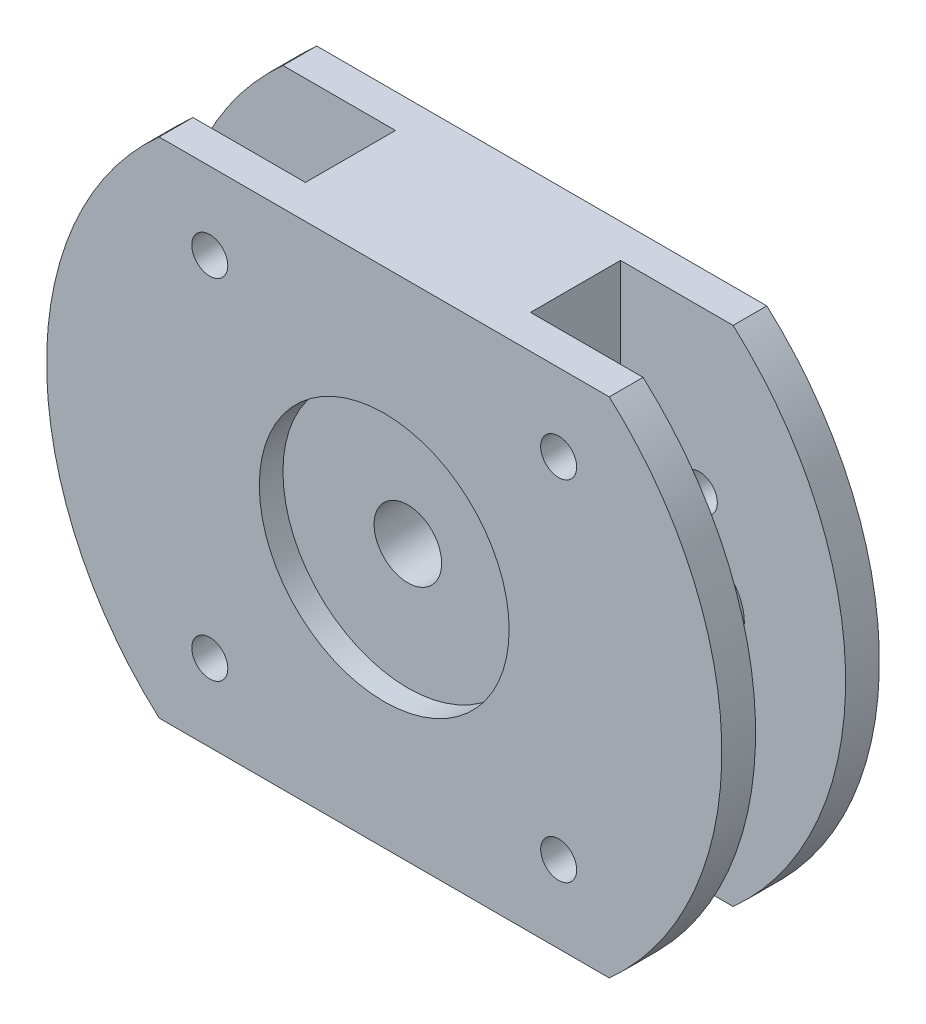
ISO-10303-21;
HEADER;
FILE_DESCRIPTION(('STEP AP214'),'2;1');
FILE_NAME('part.step','',(''),(''),'','','');
FILE_SCHEMA(('AUTOMOTIVE_DESIGN { 1 0 10303 214 1 1 1 1 }'));
ENDSEC;
DATA;
#1=APPLICATION_CONTEXT('core data for automotive mechanical design processes');
#2=APPLICATION_PROTOCOL_DEFINITION('international standard','automotive_design',2000,#1);
#3=PRODUCT_CONTEXT('',#1,'mechanical');
#4=PRODUCT('Part','Part','',(#3));
#5=PRODUCT_RELATED_PRODUCT_CATEGORY('part','',(#4));
#6=PRODUCT_DEFINITION_FORMATION('','',#4);
#7=PRODUCT_DEFINITION_CONTEXT('part definition',#1,'design');
#8=PRODUCT_DEFINITION('design','',#6,#7);
#9=PRODUCT_DEFINITION_SHAPE('','',#8);
#10=(LENGTH_UNIT() NAMED_UNIT(*) SI_UNIT(.MILLI.,.METRE.));
#11=(NAMED_UNIT(*) PLANE_ANGLE_UNIT() SI_UNIT($,.RADIAN.));
#12=(NAMED_UNIT(*) SI_UNIT($,.STERADIAN.) SOLID_ANGLE_UNIT());
#13=UNCERTAINTY_MEASURE_WITH_UNIT(LENGTH_MEASURE(1.E-05),#10,'distance_accuracy_value','');
#14=(GEOMETRIC_REPRESENTATION_CONTEXT(3) GLOBAL_UNCERTAINTY_ASSIGNED_CONTEXT((#13)) GLOBAL_UNIT_ASSIGNED_CONTEXT((#10,
#11,#12)) REPRESENTATION_CONTEXT('',''));
#15=CARTESIAN_POINT('',(0.,0.,0.));
#16=DIRECTION('',(0.,0.,1.));
#17=DIRECTION('',(1.,0.,0.));
#18=AXIS2_PLACEMENT_3D('',#15,#16,#17);
#19=CARTESIAN_POINT('',(0.,0.,-6.));
#20=DIRECTION('',(0.,0.,1.));
#21=DIRECTION('',(1.,0.,0.));
#22=AXIS2_PLACEMENT_3D('',#19,#20,#21);
#23=CYLINDRICAL_SURFACE('',#22,3.);
#24=CARTESIAN_POINT('',(0.,0.,-1.9));
#25=DIRECTION('',(0.,0.,-1.));
#26=DIRECTION('',(-1.,0.,0.));
#27=AXIS2_PLACEMENT_3D('',#24,#25,#26);
#28=CIRCLE('',#27,3.);
#29=CARTESIAN_POINT('',(-3.,0.,-1.9));
#30=VERTEX_POINT('',#29);
#31=EDGE_CURVE('E293',#30,#30,#28,.T.);
#32=ORIENTED_EDGE('',*,*,#31,.T.);
#33=EDGE_LOOP('',(#32));
#34=FACE_BOUND('',#33,.T.);
#35=CARTESIAN_POINT('',(0.,0.,11.9));
#36=DIRECTION('',(0.,0.,1.));
#37=DIRECTION('',(1.,0.,0.));
#38=AXIS2_PLACEMENT_3D('',#35,#36,#37);
#39=CIRCLE('',#38,3.);
#40=CARTESIAN_POINT('',(3.,0.,11.9));
#41=VERTEX_POINT('',#40);
#42=EDGE_CURVE('E283',#41,#41,#39,.F.);
#43=ORIENTED_EDGE('',*,*,#42,.F.);
#44=EDGE_LOOP('',(#43));
#45=FACE_BOUND('',#44,.T.);
#46=ADVANCED_FACE('F59',(#34,#45),#23,.F.);
#47=CARTESIAN_POINT('',(0.,0.,3.));
#48=DIRECTION('',(0.,0.,1.));
#49=DIRECTION('',(1.,0.,0.));
#50=AXIS2_PLACEMENT_3D('',#47,#48,#49);
#51=PLANE('',#50);
#52=CARTESIAN_POINT('',(-17.,8.,3.));
#53=DIRECTION('',(0.,0.,1.));
#54=DIRECTION('',(-1.,0.,0.));
#55=AXIS2_PLACEMENT_3D('',#52,#53,#54);
#56=CIRCLE('',#55,1.6);
#57=CARTESIAN_POINT('',(-18.6,8.,3.));
#58=VERTEX_POINT('',#57);
#59=EDGE_CURVE('E226',#58,#58,#56,.T.);
#60=ORIENTED_EDGE('',*,*,#59,.F.);
#61=EDGE_LOOP('',(#60));
#62=FACE_BOUND('',#61,.T.);
#63=CARTESIAN_POINT('',(-17.,-8.,3.));
#64=DIRECTION('',(0.,0.,1.));
#65=DIRECTION('',(1.,0.,0.));
#66=AXIS2_PLACEMENT_3D('',#63,#64,#65);
#67=CIRCLE('',#66,1.6);
#68=CARTESIAN_POINT('',(-15.4,-8.,3.));
#69=VERTEX_POINT('',#68);
#70=EDGE_CURVE('E233',#69,#69,#67,.T.);
#71=ORIENTED_EDGE('',*,*,#70,.F.);
#72=EDGE_LOOP('',(#71));
#73=FACE_BOUND('',#72,.T.);
#74=CARTESIAN_POINT('',(-17.,0.,3.));
#75=DIRECTION('',(0.,0.,1.));
#76=DIRECTION('',(1.,0.,0.));
#77=AXIS2_PLACEMENT_3D('',#74,#75,#76);
#78=CIRCLE('',#77,4.);
#79=CARTESIAN_POINT('',(-13.,0.,3.));
#80=VERTEX_POINT('',#79);
#81=EDGE_CURVE('E217',#80,#80,#78,.T.);
#82=ORIENTED_EDGE('',*,*,#81,.F.);
#83=EDGE_LOOP('',(#82));
#84=FACE_BOUND('',#83,.T.);
#85=DIRECTION('',(1.,0.,0.));
#86=VECTOR('',#85,1.);
#87=CARTESIAN_POINT('',(-20.,-22.3606797749979,3.));
#88=LINE('',#87,#86);
#89=CARTESIAN_POINT('',(-20.,-22.3606797749979,3.));
#90=VERTEX_POINT('',#89);
#91=CARTESIAN_POINT('',(-10.,-22.3606797749979,3.));
#92=VERTEX_POINT('',#91);
#93=EDGE_CURVE('E82',#90,#92,#88,.T.);
#94=ORIENTED_EDGE('',*,*,#93,.T.);
#95=DIRECTION('',(0.,-1.,0.));
#96=VECTOR('',#95,1.);
#97=CARTESIAN_POINT('',(-10.,22.3606797749979,3.));
#98=LINE('',#97,#96);
#99=CARTESIAN_POINT('',(-10.,22.3606797749979,3.));
#100=VERTEX_POINT('',#99);
#101=EDGE_CURVE('E160',#100,#92,#98,.T.);
#102=ORIENTED_EDGE('',*,*,#101,.F.);
#103=DIRECTION('',(-1.,0.,0.));
#104=VECTOR('',#103,1.);
#105=CARTESIAN_POINT('',(-20.,22.3606797749979,3.));
#106=LINE('',#105,#104);
#107=CARTESIAN_POINT('',(-20.,22.3606797749979,3.));
#108=VERTEX_POINT('',#107);
#109=EDGE_CURVE('E148',#100,#108,#106,.T.);
#110=ORIENTED_EDGE('',*,*,#109,.T.);
#111=CARTESIAN_POINT('',(0.,0.,3.));
#112=DIRECTION('',(0.,0.,1.));
#113=DIRECTION('',(1.,0.,0.));
#114=AXIS2_PLACEMENT_3D('',#111,#112,#113);
#115=CIRCLE('',#114,30.);
#116=EDGE_CURVE('E241',#108,#90,#115,.T.);
#117=ORIENTED_EDGE('',*,*,#116,.T.);
#118=EDGE_LOOP('',(#94,#102,#110,#117));
#119=FACE_BOUND('',#118,.T.);
#120=ADVANCED_FACE('F161',(#62,#73,#84,#119),#51,.T.);
#121=CARTESIAN_POINT('',(17.,8.,3.));
#122=DIRECTION('',(0.,0.,1.));
#123=DIRECTION('',(1.,0.,0.));
#124=AXIS2_PLACEMENT_3D('',#121,#122,#123);
#125=CIRCLE('',#124,1.6);
#126=CARTESIAN_POINT('',(18.6,8.,3.));
#127=VERTEX_POINT('',#126);
#128=EDGE_CURVE('E232',#127,#127,#125,.T.);
#129=ORIENTED_EDGE('',*,*,#128,.F.);
#130=EDGE_LOOP('',(#129));
#131=FACE_BOUND('',#130,.T.);
#132=CARTESIAN_POINT('',(17.,-8.,3.));
#133=DIRECTION('',(0.,0.,1.));
#134=DIRECTION('',(-1.,0.,0.));
#135=AXIS2_PLACEMENT_3D('',#132,#133,#134);
#136=CIRCLE('',#135,1.6);
#137=CARTESIAN_POINT('',(15.4,-8.,3.));
#138=VERTEX_POINT('',#137);
#139=EDGE_CURVE('E229',#138,#138,#136,.T.);
#140=ORIENTED_EDGE('',*,*,#139,.F.);
#141=EDGE_LOOP('',(#140));
#142=FACE_BOUND('',#141,.T.);
#143=CARTESIAN_POINT('',(17.,0.,3.));
#144=DIRECTION('',(0.,0.,1.));
#145=DIRECTION('',(1.,0.,0.));
#146=AXIS2_PLACEMENT_3D('',#143,#144,#145);
#147=CIRCLE('',#146,4.);
#148=CARTESIAN_POINT('',(21.,0.,3.));
#149=VERTEX_POINT('',#148);
#150=EDGE_CURVE('E220',#149,#149,#147,.T.);
#151=ORIENTED_EDGE('',*,*,#150,.F.);
#152=EDGE_LOOP('',(#151));
#153=FACE_BOUND('',#152,.T.);
#154=CARTESIAN_POINT('',(20.,22.3606797749979,3.));
#155=VERTEX_POINT('',#154);
#156=CARTESIAN_POINT('',(10.,22.3606797749979,3.));
#157=VERTEX_POINT('',#156);
#158=EDGE_CURVE('E156',#155,#157,#106,.T.);
#159=ORIENTED_EDGE('',*,*,#158,.T.);
#160=DIRECTION('',(0.,1.,0.));
#161=VECTOR('',#160,1.);
#162=CARTESIAN_POINT('',(10.,22.3606797749979,3.));
#163=LINE('',#162,#161);
#164=CARTESIAN_POINT('',(10.,-22.3606797749979,3.));
#165=VERTEX_POINT('',#164);
#166=EDGE_CURVE('E74',#165,#157,#163,.T.);
#167=ORIENTED_EDGE('',*,*,#166,.F.);
#168=CARTESIAN_POINT('',(20.,-22.3606797749979,3.));
#169=VERTEX_POINT('',#168);
#170=EDGE_CURVE('E243',#165,#169,#88,.T.);
#171=ORIENTED_EDGE('',*,*,#170,.T.);
#172=CARTESIAN_POINT('',(0.,0.,3.));
#173=DIRECTION('',(0.,0.,1.));
#174=DIRECTION('',(1.,0.,0.));
#175=AXIS2_PLACEMENT_3D('',#172,#173,#174);
#176=CIRCLE('',#175,30.);
#177=EDGE_CURVE('E157',#169,#155,#176,.T.);
#178=ORIENTED_EDGE('',*,*,#177,.T.);
#179=EDGE_LOOP('',(#159,#167,#171,#178));
#180=FACE_BOUND('',#179,.T.);
#181=ADVANCED_FACE('F326',(#131,#142,#153,#180),#51,.T.);
#182=CARTESIAN_POINT('',(0.,0.,11.));
#183=DIRECTION('',(0.,0.,1.));
#184=DIRECTION('',(1.,0.,0.));
#185=AXIS2_PLACEMENT_3D('',#182,#183,#184);
#186=PLANE('',#185);
#187=CARTESIAN_POINT('',(-15.4999999999998,15.5,11.));
#188=DIRECTION('',(0.,0.,1.));
#189=DIRECTION('',(1.,0.,0.));
#190=AXIS2_PLACEMENT_3D('',#187,#188,#189);
#191=CIRCLE('',#190,1.6);
#192=CARTESIAN_POINT('',(-13.8999999999998,15.5,11.));
#193=VERTEX_POINT('',#192);
#194=EDGE_CURVE('E163',#193,#193,#191,.T.);
#195=ORIENTED_EDGE('',*,*,#194,.T.);
#196=EDGE_LOOP('',(#195));
#197=FACE_BOUND('',#196,.T.);
#198=CARTESIAN_POINT('',(-15.5,-15.4999999999998,11.));
#199=DIRECTION('',(0.,0.,1.));
#200=DIRECTION('',(1.,0.,0.));
#201=AXIS2_PLACEMENT_3D('',#198,#199,#200);
#202=CIRCLE('',#201,1.60000000000001);
#203=CARTESIAN_POINT('',(-13.9,-15.4999999999998,11.));
#204=VERTEX_POINT('',#203);
#205=EDGE_CURVE('E438',#204,#204,#202,.T.);
#206=ORIENTED_EDGE('',*,*,#205,.T.);
#207=EDGE_LOOP('',(#206));
#208=FACE_BOUND('',#207,.T.);
#209=CARTESIAN_POINT('',(-17.,0.,11.));
#210=DIRECTION('',(0.,0.,1.));
#211=DIRECTION('',(1.,0.,0.));
#212=AXIS2_PLACEMENT_3D('',#209,#210,#211);
#213=CIRCLE('',#212,4.);
#214=CARTESIAN_POINT('',(-13.,0.,11.));
#215=VERTEX_POINT('',#214);
#216=EDGE_CURVE('E216',#215,#215,#213,.T.);
#217=ORIENTED_EDGE('',*,*,#216,.T.);
#218=EDGE_LOOP('',(#217));
#219=FACE_BOUND('',#218,.T.);
#220=DIRECTION('',(0.,-1.,0.));
#221=VECTOR('',#220,1.);
#222=CARTESIAN_POINT('',(-10.,22.3606797749979,11.));
#223=LINE('',#222,#221);
#224=CARTESIAN_POINT('',(-10.,22.3606797749979,11.));
#225=VERTEX_POINT('',#224);
#226=CARTESIAN_POINT('',(-10.,-22.3606797749979,11.));
#227=VERTEX_POINT('',#226);
#228=EDGE_CURVE('E167',#225,#227,#223,.T.);
#229=ORIENTED_EDGE('',*,*,#228,.T.);
#230=DIRECTION('',(1.,0.,0.));
#231=VECTOR('',#230,1.);
#232=CARTESIAN_POINT('',(-20.,-22.3606797749979,11.));
#233=LINE('',#232,#231);
#234=CARTESIAN_POINT('',(-20.,-22.3606797749979,11.));
#235=VERTEX_POINT('',#234);
#236=EDGE_CURVE('E187',#235,#227,#233,.T.);
#237=ORIENTED_EDGE('',*,*,#236,.F.);
#238=CARTESIAN_POINT('',(0.,0.,11.));
#239=DIRECTION('',(0.,0.,1.));
#240=DIRECTION('',(1.,0.,0.));
#241=AXIS2_PLACEMENT_3D('',#238,#239,#240);
#242=CIRCLE('',#241,30.);
#243=CARTESIAN_POINT('',(-20.,22.3606797749979,11.));
#244=VERTEX_POINT('',#243);
#245=EDGE_CURVE('E200',#244,#235,#242,.T.);
#246=ORIENTED_EDGE('',*,*,#245,.F.);
#247=DIRECTION('',(-1.,0.,0.));
#248=VECTOR('',#247,1.);
#249=CARTESIAN_POINT('',(20.,22.3606797749979,11.));
#250=LINE('',#249,#248);
#251=EDGE_CURVE('E196',#225,#244,#250,.T.);
#252=ORIENTED_EDGE('',*,*,#251,.F.);
#253=EDGE_LOOP('',(#229,#237,#246,#252));
#254=FACE_BOUND('',#253,.T.);
#255=ADVANCED_FACE('F364',(#197,#208,#219,#254),#186,.F.);
#256=CARTESIAN_POINT('',(15.4999999999998,-15.5,11.));
#257=DIRECTION('',(0.,0.,1.));
#258=DIRECTION('',(1.,0.,0.));
#259=AXIS2_PLACEMENT_3D('',#256,#257,#258);
#260=CIRCLE('',#259,1.60000000000001);
#261=CARTESIAN_POINT('',(17.0999999999999,-15.5,11.));
#262=VERTEX_POINT('',#261);
#263=EDGE_CURVE('E441',#262,#262,#260,.T.);
#264=ORIENTED_EDGE('',*,*,#263,.T.);
#265=EDGE_LOOP('',(#264));
#266=FACE_BOUND('',#265,.T.);
#267=CARTESIAN_POINT('',(15.5,15.4999999999998,11.));
#268=DIRECTION('',(0.,0.,1.));
#269=DIRECTION('',(1.,0.,0.));
#270=AXIS2_PLACEMENT_3D('',#267,#268,#269);
#271=CIRCLE('',#270,1.6);
#272=CARTESIAN_POINT('',(17.1,15.4999999999998,11.));
#273=VERTEX_POINT('',#272);
#274=EDGE_CURVE('E444',#273,#273,#271,.T.);
#275=ORIENTED_EDGE('',*,*,#274,.T.);
#276=EDGE_LOOP('',(#275));
#277=FACE_BOUND('',#276,.T.);
#278=CARTESIAN_POINT('',(17.,0.,11.));
#279=DIRECTION('',(0.,0.,1.));
#280=DIRECTION('',(1.,0.,0.));
#281=AXIS2_PLACEMENT_3D('',#278,#279,#280);
#282=CIRCLE('',#281,4.);
#283=CARTESIAN_POINT('',(21.,0.,11.));
#284=VERTEX_POINT('',#283);
#285=EDGE_CURVE('E223',#284,#284,#282,.T.);
#286=ORIENTED_EDGE('',*,*,#285,.T.);
#287=EDGE_LOOP('',(#286));
#288=FACE_BOUND('',#287,.T.);
#289=DIRECTION('',(0.,1.,0.));
#290=VECTOR('',#289,1.);
#291=CARTESIAN_POINT('',(10.,22.3606797749979,11.));
#292=LINE('',#291,#290);
#293=CARTESIAN_POINT('',(10.,-22.3606797749979,11.));
#294=VERTEX_POINT('',#293);
#295=CARTESIAN_POINT('',(10.,22.3606797749979,11.));
#296=VERTEX_POINT('',#295);
#297=EDGE_CURVE('E177',#294,#296,#292,.T.);
#298=ORIENTED_EDGE('',*,*,#297,.T.);
#299=CARTESIAN_POINT('',(20.,22.3606797749979,11.));
#300=VERTEX_POINT('',#299);
#301=EDGE_CURVE('E197',#300,#296,#250,.T.);
#302=ORIENTED_EDGE('',*,*,#301,.F.);
#303=CARTESIAN_POINT('',(0.,0.,11.));
#304=DIRECTION('',(0.,0.,1.));
#305=DIRECTION('',(1.,0.,0.));
#306=AXIS2_PLACEMENT_3D('',#303,#304,#305);
#307=CIRCLE('',#306,30.);
#308=CARTESIAN_POINT('',(20.,-22.3606797749979,11.));
#309=VERTEX_POINT('',#308);
#310=EDGE_CURVE('E180',#309,#300,#307,.T.);
#311=ORIENTED_EDGE('',*,*,#310,.F.);
#312=EDGE_CURVE('E202',#294,#309,#233,.T.);
#313=ORIENTED_EDGE('',*,*,#312,.F.);
#314=EDGE_LOOP('',(#298,#302,#311,#313));
#315=FACE_BOUND('',#314,.T.);
#316=ADVANCED_FACE('F367',(#266,#277,#288,#315),#186,.F.);
#317=CARTESIAN_POINT('',(0.,0.,3.));
#318=DIRECTION('',(0.,0.,-1.));
#319=DIRECTION('',(-1.,0.,0.));
#320=AXIS2_PLACEMENT_3D('',#317,#318,#319);
#321=CYLINDRICAL_SURFACE('',#320,30.);
#322=CARTESIAN_POINT('',(0.,0.,0.));
#323=DIRECTION('',(0.,0.,1.));
#324=DIRECTION('',(1.,0.,0.));
#325=AXIS2_PLACEMENT_3D('',#322,#323,#324);
#326=CIRCLE('',#325,30.);
#327=CARTESIAN_POINT('',(-20.,22.3606797749979,0.));
#328=VERTEX_POINT('',#327);
#329=CARTESIAN_POINT('',(-20.,-22.3606797749979,0.));
#330=VERTEX_POINT('',#329);
#331=EDGE_CURVE('E247',#328,#330,#326,.T.);
#332=ORIENTED_EDGE('',*,*,#331,.T.);
#333=DIRECTION('',(0.,0.,-1.));
#334=VECTOR('',#333,1.);
#335=CARTESIAN_POINT('',(-20.,-22.3606797749979,3.));
#336=LINE('',#335,#334);
#337=EDGE_CURVE('E263',#90,#330,#336,.T.);
#338=ORIENTED_EDGE('',*,*,#337,.F.);
#339=ORIENTED_EDGE('',*,*,#116,.F.);
#340=DIRECTION('',(0.,0.,-1.));
#341=VECTOR('',#340,1.);
#342=CARTESIAN_POINT('',(-20.,22.3606797749979,3.));
#343=LINE('',#342,#341);
#344=EDGE_CURVE('E154',#108,#328,#343,.T.);
#345=ORIENTED_EDGE('',*,*,#344,.T.);
#346=EDGE_LOOP('',(#332,#338,#339,#345));
#347=FACE_BOUND('',#346,.T.);
#348=ADVANCED_FACE('F418',(#347),#321,.T.);
#349=CARTESIAN_POINT('',(-20.,-22.3606797749979,3.));
#350=DIRECTION('',(0.,1.,0.));
#351=DIRECTION('',(0.,0.,1.));
#352=AXIS2_PLACEMENT_3D('',#349,#350,#351);
#353=PLANE('',#352);
#354=DIRECTION('',(1.,0.,0.));
#355=VECTOR('',#354,1.);
#356=CARTESIAN_POINT('',(-20.,-22.3606797749979,0.));
#357=LINE('',#356,#355);
#358=CARTESIAN_POINT('',(20.,-22.3606797749979,0.));
#359=VERTEX_POINT('',#358);
#360=EDGE_CURVE('E250',#330,#359,#357,.T.);
#361=ORIENTED_EDGE('',*,*,#360,.T.);
#362=DIRECTION('',(0.,0.,-1.));
#363=VECTOR('',#362,1.);
#364=CARTESIAN_POINT('',(20.,-22.3606797749979,3.));
#365=LINE('',#364,#363);
#366=EDGE_CURVE('E260',#169,#359,#365,.T.);
#367=ORIENTED_EDGE('',*,*,#366,.F.);
#368=ORIENTED_EDGE('',*,*,#170,.F.);
#369=DIRECTION('',(0.,0.,-1.));
#370=VECTOR('',#369,1.);
#371=CARTESIAN_POINT('',(10.,-22.3606797749979,14.002));
#372=LINE('',#371,#370);
#373=EDGE_CURVE('E172',#294,#165,#372,.T.);
#374=ORIENTED_EDGE('',*,*,#373,.F.);
#375=ORIENTED_EDGE('',*,*,#312,.T.);
#376=DIRECTION('',(0.,0.,-1.));
#377=VECTOR('',#376,1.);
#378=CARTESIAN_POINT('',(20.,-22.3606797749979,14.));
#379=LINE('',#378,#377);
#380=CARTESIAN_POINT('',(20.,-22.3606797749979,14.));
#381=VERTEX_POINT('',#380);
#382=EDGE_CURVE('E193',#381,#309,#379,.T.);
#383=ORIENTED_EDGE('',*,*,#382,.F.);
#384=DIRECTION('',(1.,0.,0.));
#385=VECTOR('',#384,1.);
#386=CARTESIAN_POINT('',(-20.,-22.3606797749979,14.));
#387=LINE('',#386,#385);
#388=CARTESIAN_POINT('',(-20.,-22.3606797749979,14.));
#389=VERTEX_POINT('',#388);
#390=EDGE_CURVE('E191',#389,#381,#387,.T.);
#391=ORIENTED_EDGE('',*,*,#390,.F.);
#392=DIRECTION('',(0.,0.,-1.));
#393=VECTOR('',#392,1.);
#394=CARTESIAN_POINT('',(-20.,-22.3606797749979,14.));
#395=LINE('',#394,#393);
#396=EDGE_CURVE('E207',#389,#235,#395,.T.);
#397=ORIENTED_EDGE('',*,*,#396,.T.);
#398=ORIENTED_EDGE('',*,*,#236,.T.);
#399=DIRECTION('',(0.,0.,-1.));
#400=VECTOR('',#399,1.);
#401=CARTESIAN_POINT('',(-10.,-22.3606797749979,14.002));
#402=LINE('',#401,#400);
#403=EDGE_CURVE('E182',#227,#92,#402,.T.);
#404=ORIENTED_EDGE('',*,*,#403,.T.);
#405=ORIENTED_EDGE('',*,*,#93,.F.);
#406=ORIENTED_EDGE('',*,*,#337,.T.);
#407=EDGE_LOOP('',(#361,#367,#368,#374,#375,#383,#391,#397,#398,#404,#405,#406));
#408=FACE_BOUND('',#407,.T.);
#409=ADVANCED_FACE('F414',(#408),#353,.F.);
#410=CARTESIAN_POINT('',(0.,0.,3.));
#411=DIRECTION('',(0.,0.,-1.));
#412=DIRECTION('',(-1.,0.,0.));
#413=AXIS2_PLACEMENT_3D('',#410,#411,#412);
#414=CYLINDRICAL_SURFACE('',#413,30.);
#415=CARTESIAN_POINT('',(0.,0.,0.));
#416=DIRECTION('',(0.,0.,1.));
#417=DIRECTION('',(1.,0.,0.));
#418=AXIS2_PLACEMENT_3D('',#415,#416,#417);
#419=CIRCLE('',#418,30.);
#420=CARTESIAN_POINT('',(20.,22.3606797749979,0.));
#421=VERTEX_POINT('',#420);
#422=EDGE_CURVE('E253',#359,#421,#419,.T.);
#423=ORIENTED_EDGE('',*,*,#422,.T.);
#424=DIRECTION('',(0.,0.,-1.));
#425=VECTOR('',#424,1.);
#426=CARTESIAN_POINT('',(20.,22.3606797749979,3.));
#427=LINE('',#426,#425);
#428=EDGE_CURVE('E257',#155,#421,#427,.T.);
#429=ORIENTED_EDGE('',*,*,#428,.F.);
#430=ORIENTED_EDGE('',*,*,#177,.F.);
#431=ORIENTED_EDGE('',*,*,#366,.T.);
#432=EDGE_LOOP('',(#423,#429,#430,#431));
#433=FACE_BOUND('',#432,.T.);
#434=ADVANCED_FACE('F411',(#433),#414,.T.);
#435=CARTESIAN_POINT('',(-20.,22.3606797749979,3.));
#436=DIRECTION('',(0.,-1.,0.));
#437=DIRECTION('',(0.,0.,-1.));
#438=AXIS2_PLACEMENT_3D('',#435,#436,#437);
#439=PLANE('',#438);
#440=DIRECTION('',(-1.,0.,0.));
#441=VECTOR('',#440,1.);
#442=CARTESIAN_POINT('',(-20.,22.3606797749979,0.));
#443=LINE('',#442,#441);
#444=EDGE_CURVE('E244',#421,#328,#443,.T.);
#445=ORIENTED_EDGE('',*,*,#444,.T.);
#446=ORIENTED_EDGE('',*,*,#344,.F.);
#447=ORIENTED_EDGE('',*,*,#109,.F.);
#448=DIRECTION('',(0.,0.,-1.));
#449=VECTOR('',#448,1.);
#450=CARTESIAN_POINT('',(-10.,22.3606797749979,14.002));
#451=LINE('',#450,#449);
#452=EDGE_CURVE('E151',#225,#100,#451,.T.);
#453=ORIENTED_EDGE('',*,*,#452,.F.);
#454=ORIENTED_EDGE('',*,*,#251,.T.);
#455=DIRECTION('',(0.,0.,-1.));
#456=VECTOR('',#455,1.);
#457=CARTESIAN_POINT('',(-20.,22.3606797749979,14.));
#458=LINE('',#457,#456);
#459=CARTESIAN_POINT('',(-20.,22.3606797749979,14.));
#460=VERTEX_POINT('',#459);
#461=EDGE_CURVE('E210',#460,#244,#458,.T.);
#462=ORIENTED_EDGE('',*,*,#461,.F.);
#463=DIRECTION('',(-1.,0.,0.));
#464=VECTOR('',#463,1.);
#465=CARTESIAN_POINT('',(20.,22.3606797749979,14.));
#466=LINE('',#465,#464);
#467=CARTESIAN_POINT('',(20.,22.3606797749979,14.));
#468=VERTEX_POINT('',#467);
#469=EDGE_CURVE('E186',#468,#460,#466,.T.);
#470=ORIENTED_EDGE('',*,*,#469,.F.);
#471=DIRECTION('',(0.,0.,-1.));
#472=VECTOR('',#471,1.);
#473=CARTESIAN_POINT('',(20.,22.3606797749979,14.));
#474=LINE('',#473,#472);
#475=EDGE_CURVE('E213',#468,#300,#474,.T.);
#476=ORIENTED_EDGE('',*,*,#475,.T.);
#477=ORIENTED_EDGE('',*,*,#301,.T.);
#478=DIRECTION('',(0.,0.,-1.));
#479=VECTOR('',#478,1.);
#480=CARTESIAN_POINT('',(10.,22.3606797749979,14.002));
#481=LINE('',#480,#479);
#482=EDGE_CURVE('E169',#296,#157,#481,.T.);
#483=ORIENTED_EDGE('',*,*,#482,.T.);
#484=ORIENTED_EDGE('',*,*,#158,.F.);
#485=ORIENTED_EDGE('',*,*,#428,.T.);
#486=EDGE_LOOP('',(#445,#446,#447,#453,#454,#462,#470,#476,#477,#483,#484,#485));
#487=FACE_BOUND('',#486,.T.);
#488=ADVANCED_FACE('F149',(#487),#439,.F.);
#489=CARTESIAN_POINT('',(0.,0.,0.));
#490=DIRECTION('',(0.,0.,1.));
#491=DIRECTION('',(1.,0.,0.));
#492=AXIS2_PLACEMENT_3D('',#489,#490,#491);
#493=PLANE('',#492);
#494=CARTESIAN_POINT('',(0.,0.,0.));
#495=DIRECTION('',(0.,0.,1.));
#496=DIRECTION('',(1.,0.,0.));
#497=AXIS2_PLACEMENT_3D('',#494,#495,#496);
#498=CIRCLE('',#497,5.5);
#499=CARTESIAN_POINT('',(5.5,0.,0.));
#500=VERTEX_POINT('',#499);
#501=EDGE_CURVE('E12',#500,#500,#498,.T.);
#502=ORIENTED_EDGE('',*,*,#501,.T.);
#503=EDGE_LOOP('',(#502));
#504=FACE_BOUND('',#503,.T.);
#505=CARTESIAN_POINT('',(-17.,8.,0.));
#506=DIRECTION('',(0.,0.,1.));
#507=DIRECTION('',(1.,0.,0.));
#508=AXIS2_PLACEMENT_3D('',#505,#506,#507);
#509=CIRCLE('',#508,1.6);
#510=CARTESIAN_POINT('',(-15.4,8.,0.));
#511=VERTEX_POINT('',#510);
#512=EDGE_CURVE('E251',#511,#511,#509,.T.);
#513=ORIENTED_EDGE('',*,*,#512,.T.);
#514=EDGE_LOOP('',(#513));
#515=FACE_BOUND('',#514,.T.);
#516=CARTESIAN_POINT('',(-17.,-8.,0.));
#517=DIRECTION('',(0.,0.,1.));
#518=DIRECTION('',(1.,0.,0.));
#519=AXIS2_PLACEMENT_3D('',#516,#517,#518);
#520=CIRCLE('',#519,1.6);
#521=CARTESIAN_POINT('',(-15.4,-8.,0.));
#522=VERTEX_POINT('',#521);
#523=EDGE_CURVE('E278',#522,#522,#520,.T.);
#524=ORIENTED_EDGE('',*,*,#523,.T.);
#525=EDGE_LOOP('',(#524));
#526=FACE_BOUND('',#525,.T.);
#527=CARTESIAN_POINT('',(17.,-8.,0.));
#528=DIRECTION('',(0.,0.,1.));
#529=DIRECTION('',(1.,0.,0.));
#530=AXIS2_PLACEMENT_3D('',#527,#528,#529);
#531=CIRCLE('',#530,1.6);
#532=CARTESIAN_POINT('',(18.6,-8.,0.));
#533=VERTEX_POINT('',#532);
#534=EDGE_CURVE('E275',#533,#533,#531,.T.);
#535=ORIENTED_EDGE('',*,*,#534,.T.);
#536=EDGE_LOOP('',(#535));
#537=FACE_BOUND('',#536,.T.);
#538=CARTESIAN_POINT('',(17.,0.,0.));
#539=DIRECTION('',(0.,0.,1.));
#540=DIRECTION('',(1.,0.,0.));
#541=AXIS2_PLACEMENT_3D('',#538,#539,#540);
#542=CIRCLE('',#541,2.55);
#543=CARTESIAN_POINT('',(19.55,0.,0.));
#544=VERTEX_POINT('',#543);
#545=EDGE_CURVE('E272',#544,#544,#542,.T.);
#546=ORIENTED_EDGE('',*,*,#545,.T.);
#547=EDGE_LOOP('',(#546));
#548=FACE_BOUND('',#547,.T.);
#549=CARTESIAN_POINT('',(-17.,0.,0.));
#550=DIRECTION('',(0.,0.,1.));
#551=DIRECTION('',(1.,0.,0.));
#552=AXIS2_PLACEMENT_3D('',#549,#550,#551);
#553=CIRCLE('',#552,2.55);
#554=CARTESIAN_POINT('',(-14.45,0.,0.));
#555=VERTEX_POINT('',#554);
#556=EDGE_CURVE('E269',#555,#555,#553,.T.);
#557=ORIENTED_EDGE('',*,*,#556,.T.);
#558=EDGE_LOOP('',(#557));
#559=FACE_BOUND('',#558,.T.);
#560=CARTESIAN_POINT('',(17.,8.,0.));
#561=DIRECTION('',(0.,0.,1.));
#562=DIRECTION('',(1.,0.,0.));
#563=AXIS2_PLACEMENT_3D('',#560,#561,#562);
#564=CIRCLE('',#563,1.6);
#565=CARTESIAN_POINT('',(18.6,8.,0.));
#566=VERTEX_POINT('',#565);
#567=EDGE_CURVE('E240',#566,#566,#564,.T.);
#568=ORIENTED_EDGE('',*,*,#567,.T.);
#569=EDGE_LOOP('',(#568));
#570=FACE_BOUND('',#569,.T.);
#571=ORIENTED_EDGE('',*,*,#331,.F.);
#572=ORIENTED_EDGE('',*,*,#444,.F.);
#573=ORIENTED_EDGE('',*,*,#422,.F.);
#574=ORIENTED_EDGE('',*,*,#360,.F.);
#575=EDGE_LOOP('',(#571,#572,#573,#574));
#576=FACE_BOUND('',#575,.T.);
#577=ADVANCED_FACE('F404',(#504,#515,#526,#537,#548,#559,#570,#576),#493,.F.);
#578=CARTESIAN_POINT('',(17.,8.,-2.));
#579=DIRECTION('',(0.,0.,1.));
#580=DIRECTION('',(1.,0.,0.));
#581=AXIS2_PLACEMENT_3D('',#578,#579,#580);
#582=CYLINDRICAL_SURFACE('',#581,1.6);
#583=ORIENTED_EDGE('',*,*,#128,.T.);
#584=EDGE_LOOP('',(#583));
#585=FACE_BOUND('',#584,.T.);
#586=ORIENTED_EDGE('',*,*,#567,.F.);
#587=EDGE_LOOP('',(#586));
#588=FACE_BOUND('',#587,.T.);
#589=ADVANCED_FACE('F387',(#585,#588),#582,.F.);
#590=CARTESIAN_POINT('',(-17.,0.,-2.));
#591=DIRECTION('',(0.,0.,1.));
#592=DIRECTION('',(1.,0.,0.));
#593=AXIS2_PLACEMENT_3D('',#590,#591,#592);
#594=CYLINDRICAL_SURFACE('',#593,2.55);
#595=CARTESIAN_POINT('',(-17.,0.,6.));
#596=DIRECTION('',(0.,0.,-1.));
#597=DIRECTION('',(-1.,0.,0.));
#598=AXIS2_PLACEMENT_3D('',#595,#596,#597);
#599=CIRCLE('',#598,2.55);
#600=CARTESIAN_POINT('',(-19.55,0.,6.));
#601=VERTEX_POINT('',#600);
#602=EDGE_CURVE('E466',#601,#601,#599,.T.);
#603=ORIENTED_EDGE('',*,*,#602,.F.);
#604=EDGE_LOOP('',(#603));
#605=FACE_BOUND('',#604,.T.);
#606=ORIENTED_EDGE('',*,*,#556,.F.);
#607=EDGE_LOOP('',(#606));
#608=FACE_BOUND('',#607,.T.);
#609=ADVANCED_FACE('F383',(#605,#608),#594,.F.);
#610=CARTESIAN_POINT('',(17.,0.,-2.));
#611=DIRECTION('',(0.,0.,1.));
#612=DIRECTION('',(1.,0.,0.));
#613=AXIS2_PLACEMENT_3D('',#610,#611,#612);
#614=CYLINDRICAL_SURFACE('',#613,2.55);
#615=CARTESIAN_POINT('',(17.,0.,6.));
#616=DIRECTION('',(0.,0.,-1.));
#617=DIRECTION('',(-1.,0.,0.));
#618=AXIS2_PLACEMENT_3D('',#615,#616,#617);
#619=CIRCLE('',#618,2.55);
#620=CARTESIAN_POINT('',(14.45,0.,6.));
#621=VERTEX_POINT('',#620);
#622=EDGE_CURVE('E461',#621,#621,#619,.T.);
#623=ORIENTED_EDGE('',*,*,#622,.F.);
#624=EDGE_LOOP('',(#623));
#625=FACE_BOUND('',#624,.T.);
#626=ORIENTED_EDGE('',*,*,#545,.F.);
#627=EDGE_LOOP('',(#626));
#628=FACE_BOUND('',#627,.T.);
#629=ADVANCED_FACE('F386',(#625,#628),#614,.F.);
#630=CARTESIAN_POINT('',(17.,-8.,-2.));
#631=DIRECTION('',(0.,0.,1.));
#632=DIRECTION('',(1.,0.,0.));
#633=AXIS2_PLACEMENT_3D('',#630,#631,#632);
#634=CYLINDRICAL_SURFACE('',#633,1.6);
#635=ORIENTED_EDGE('',*,*,#139,.T.);
#636=EDGE_LOOP('',(#635));
#637=FACE_BOUND('',#636,.T.);
#638=ORIENTED_EDGE('',*,*,#534,.F.);
#639=EDGE_LOOP('',(#638));
#640=FACE_BOUND('',#639,.T.);
#641=ADVANCED_FACE('F391',(#637,#640),#634,.F.);
#642=CARTESIAN_POINT('',(-17.,-8.,-2.));
#643=DIRECTION('',(0.,0.,1.));
#644=DIRECTION('',(1.,0.,0.));
#645=AXIS2_PLACEMENT_3D('',#642,#643,#644);
#646=CYLINDRICAL_SURFACE('',#645,1.6);
#647=ORIENTED_EDGE('',*,*,#70,.T.);
#648=EDGE_LOOP('',(#647));
#649=FACE_BOUND('',#648,.T.);
#650=ORIENTED_EDGE('',*,*,#523,.F.);
#651=EDGE_LOOP('',(#650));
#652=FACE_BOUND('',#651,.T.);
#653=ADVANCED_FACE('F395',(#649,#652),#646,.F.);
#654=CARTESIAN_POINT('',(-17.,8.,-2.));
#655=DIRECTION('',(0.,0.,1.));
#656=DIRECTION('',(1.,0.,0.));
#657=AXIS2_PLACEMENT_3D('',#654,#655,#656);
#658=CYLINDRICAL_SURFACE('',#657,1.6);
#659=ORIENTED_EDGE('',*,*,#59,.T.);
#660=EDGE_LOOP('',(#659));
#661=FACE_BOUND('',#660,.T.);
#662=ORIENTED_EDGE('',*,*,#512,.F.);
#663=EDGE_LOOP('',(#662));
#664=FACE_BOUND('',#663,.T.);
#665=ADVANCED_FACE('F381',(#661,#664),#658,.F.);
#666=CARTESIAN_POINT('',(17.,0.,11.));
#667=DIRECTION('',(0.,0.,-1.));
#668=DIRECTION('',(-1.,0.,0.));
#669=AXIS2_PLACEMENT_3D('',#666,#667,#668);
#670=CYLINDRICAL_SURFACE('',#669,4.);
#671=ORIENTED_EDGE('',*,*,#285,.F.);
#672=EDGE_LOOP('',(#671));
#673=FACE_BOUND('',#672,.T.);
#674=ORIENTED_EDGE('',*,*,#150,.T.);
#675=EDGE_LOOP('',(#674));
#676=FACE_BOUND('',#675,.T.);
#677=ADVANCED_FACE('F377',(#673,#676),#670,.T.);
#678=CARTESIAN_POINT('',(-17.,0.,11.));
#679=DIRECTION('',(0.,0.,-1.));
#680=DIRECTION('',(-1.,0.,0.));
#681=AXIS2_PLACEMENT_3D('',#678,#679,#680);
#682=CYLINDRICAL_SURFACE('',#681,4.);
#683=ORIENTED_EDGE('',*,*,#216,.F.);
#684=EDGE_LOOP('',(#683));
#685=FACE_BOUND('',#684,.T.);
#686=ORIENTED_EDGE('',*,*,#81,.T.);
#687=EDGE_LOOP('',(#686));
#688=FACE_BOUND('',#687,.T.);
#689=ADVANCED_FACE('F362',(#685,#688),#682,.T.);
#690=CARTESIAN_POINT('',(0.,0.,14.));
#691=DIRECTION('',(0.,0.,1.));
#692=DIRECTION('',(1.,0.,0.));
#693=AXIS2_PLACEMENT_3D('',#690,#691,#692);
#694=PLANE('',#693);
#695=CARTESIAN_POINT('',(0.,0.,14.));
#696=DIRECTION('',(0.,0.,1.));
#697=DIRECTION('',(1.,0.,0.));
#698=AXIS2_PLACEMENT_3D('',#695,#696,#697);
#699=CIRCLE('',#698,11.1);
#700=CARTESIAN_POINT('',(11.1,0.,14.));
#701=VERTEX_POINT('',#700);
#702=EDGE_CURVE('E458',#701,#701,#699,.T.);
#703=ORIENTED_EDGE('',*,*,#702,.F.);
#704=EDGE_LOOP('',(#703));
#705=FACE_BOUND('',#704,.T.);
#706=CARTESIAN_POINT('',(-15.4999999999998,15.5,14.));
#707=DIRECTION('',(0.,0.,1.));
#708=DIRECTION('',(1.,0.,0.));
#709=AXIS2_PLACEMENT_3D('',#706,#707,#708);
#710=CIRCLE('',#709,1.6);
#711=CARTESIAN_POINT('',(-13.8999999999998,15.5,14.));
#712=VERTEX_POINT('',#711);
#713=EDGE_CURVE('E286',#712,#712,#710,.T.);
#714=ORIENTED_EDGE('',*,*,#713,.F.);
#715=EDGE_LOOP('',(#714));
#716=FACE_BOUND('',#715,.T.);
#717=CARTESIAN_POINT('',(-15.5,-15.4999999999998,14.));
#718=DIRECTION('',(0.,0.,1.));
#719=DIRECTION('',(1.,0.,0.));
#720=AXIS2_PLACEMENT_3D('',#717,#718,#719);
#721=CIRCLE('',#720,1.60000000000001);
#722=CARTESIAN_POINT('',(-13.9,-15.4999999999998,14.));
#723=VERTEX_POINT('',#722);
#724=EDGE_CURVE('E453',#723,#723,#721,.T.);
#725=ORIENTED_EDGE('',*,*,#724,.F.);
#726=EDGE_LOOP('',(#725));
#727=FACE_BOUND('',#726,.T.);
#728=CARTESIAN_POINT('',(15.4999999999998,-15.5,14.));
#729=DIRECTION('',(0.,0.,1.));
#730=DIRECTION('',(1.,0.,0.));
#731=AXIS2_PLACEMENT_3D('',#728,#729,#730);
#732=CIRCLE('',#731,1.60000000000001);
#733=CARTESIAN_POINT('',(17.0999999999999,-15.5,14.));
#734=VERTEX_POINT('',#733);
#735=EDGE_CURVE('E450',#734,#734,#732,.T.);
#736=ORIENTED_EDGE('',*,*,#735,.F.);
#737=EDGE_LOOP('',(#736));
#738=FACE_BOUND('',#737,.T.);
#739=CARTESIAN_POINT('',(15.5,15.4999999999998,14.));
#740=DIRECTION('',(0.,0.,1.));
#741=DIRECTION('',(1.,0.,0.));
#742=AXIS2_PLACEMENT_3D('',#739,#740,#741);
#743=CIRCLE('',#742,1.6);
#744=CARTESIAN_POINT('',(17.1,15.4999999999998,14.));
#745=VERTEX_POINT('',#744);
#746=EDGE_CURVE('E447',#745,#745,#743,.T.);
#747=ORIENTED_EDGE('',*,*,#746,.F.);
#748=EDGE_LOOP('',(#747));
#749=FACE_BOUND('',#748,.T.);
#750=CARTESIAN_POINT('',(0.,0.,14.));
#751=DIRECTION('',(0.,0.,1.));
#752=DIRECTION('',(1.,0.,0.));
#753=AXIS2_PLACEMENT_3D('',#750,#751,#752);
#754=CIRCLE('',#753,30.);
#755=EDGE_CURVE('E183',#381,#468,#754,.T.);
#756=ORIENTED_EDGE('',*,*,#755,.T.);
#757=ORIENTED_EDGE('',*,*,#469,.T.);
#758=CARTESIAN_POINT('',(0.,0.,14.));
#759=DIRECTION('',(0.,0.,1.));
#760=DIRECTION('',(1.,0.,0.));
#761=AXIS2_PLACEMENT_3D('',#758,#759,#760);
#762=CIRCLE('',#761,30.);
#763=EDGE_CURVE('E189',#460,#389,#762,.T.);
#764=ORIENTED_EDGE('',*,*,#763,.T.);
#765=ORIENTED_EDGE('',*,*,#390,.T.);
#766=EDGE_LOOP('',(#756,#757,#764,#765));
#767=FACE_BOUND('',#766,.T.);
#768=ADVANCED_FACE('F358',(#705,#716,#727,#738,#749,#767),#694,.T.);
#769=CARTESIAN_POINT('',(0.,0.,14.));
#770=DIRECTION('',(0.,0.,-1.));
#771=DIRECTION('',(-1.,0.,0.));
#772=AXIS2_PLACEMENT_3D('',#769,#770,#771);
#773=CYLINDRICAL_SURFACE('',#772,30.);
#774=ORIENTED_EDGE('',*,*,#245,.T.);
#775=ORIENTED_EDGE('',*,*,#396,.F.);
#776=ORIENTED_EDGE('',*,*,#763,.F.);
#777=ORIENTED_EDGE('',*,*,#461,.T.);
#778=EDGE_LOOP('',(#774,#775,#776,#777));
#779=FACE_BOUND('',#778,.T.);
#780=ADVANCED_FACE('F361',(#779),#773,.T.);
#781=CARTESIAN_POINT('',(0.,0.,14.));
#782=DIRECTION('',(0.,0.,-1.));
#783=DIRECTION('',(-1.,0.,0.));
#784=AXIS2_PLACEMENT_3D('',#781,#782,#783);
#785=CYLINDRICAL_SURFACE('',#784,30.);
#786=ORIENTED_EDGE('',*,*,#310,.T.);
#787=ORIENTED_EDGE('',*,*,#475,.F.);
#788=ORIENTED_EDGE('',*,*,#755,.F.);
#789=ORIENTED_EDGE('',*,*,#382,.T.);
#790=EDGE_LOOP('',(#786,#787,#788,#789));
#791=FACE_BOUND('',#790,.T.);
#792=ADVANCED_FACE('F355',(#791),#785,.T.);
#793=CARTESIAN_POINT('',(-10.,22.3606797749979,14.002));
#794=DIRECTION('',(1.,0.,0.));
#795=DIRECTION('',(0.,1.,0.));
#796=AXIS2_PLACEMENT_3D('',#793,#794,#795);
#797=PLANE('',#796);
#798=ORIENTED_EDGE('',*,*,#228,.F.);
#799=ORIENTED_EDGE('',*,*,#452,.T.);
#800=ORIENTED_EDGE('',*,*,#101,.T.);
#801=ORIENTED_EDGE('',*,*,#403,.F.);
#802=EDGE_LOOP('',(#798,#799,#800,#801));
#803=FACE_BOUND('',#802,.T.);
#804=ADVANCED_FACE('F165',(#803),#797,.F.);
#805=CARTESIAN_POINT('',(10.,22.3606797749979,14.002));
#806=DIRECTION('',(-1.,0.,0.));
#807=DIRECTION('',(0.,-1.,0.));
#808=AXIS2_PLACEMENT_3D('',#805,#806,#807);
#809=PLANE('',#808);
#810=ORIENTED_EDGE('',*,*,#297,.F.);
#811=ORIENTED_EDGE('',*,*,#373,.T.);
#812=ORIENTED_EDGE('',*,*,#166,.T.);
#813=ORIENTED_EDGE('',*,*,#482,.F.);
#814=EDGE_LOOP('',(#810,#811,#812,#813));
#815=FACE_BOUND('',#814,.T.);
#816=ADVANCED_FACE('F350',(#815),#809,.F.);
#817=CARTESIAN_POINT('',(15.5,15.4999999999998,4.));
#818=DIRECTION('',(0.,0.,1.));
#819=DIRECTION('',(1.,0.,0.));
#820=AXIS2_PLACEMENT_3D('',#817,#818,#819);
#821=CYLINDRICAL_SURFACE('',#820,1.6);
#822=ORIENTED_EDGE('',*,*,#746,.T.);
#823=EDGE_LOOP('',(#822));
#824=FACE_BOUND('',#823,.T.);
#825=ORIENTED_EDGE('',*,*,#274,.F.);
#826=EDGE_LOOP('',(#825));
#827=FACE_BOUND('',#826,.T.);
#828=ADVANCED_FACE('F338',(#824,#827),#821,.F.);
#829=CARTESIAN_POINT('',(15.4999999999998,-15.5,4.));
#830=DIRECTION('',(0.,0.,1.));
#831=DIRECTION('',(1.,0.,0.));
#832=AXIS2_PLACEMENT_3D('',#829,#830,#831);
#833=CYLINDRICAL_SURFACE('',#832,1.60000000000001);
#834=ORIENTED_EDGE('',*,*,#735,.T.);
#835=EDGE_LOOP('',(#834));
#836=FACE_BOUND('',#835,.T.);
#837=ORIENTED_EDGE('',*,*,#263,.F.);
#838=EDGE_LOOP('',(#837));
#839=FACE_BOUND('',#838,.T.);
#840=ADVANCED_FACE('F334',(#836,#839),#833,.F.);
#841=CARTESIAN_POINT('',(-15.5,-15.4999999999998,4.));
#842=DIRECTION('',(0.,0.,1.));
#843=DIRECTION('',(1.,0.,0.));
#844=AXIS2_PLACEMENT_3D('',#841,#842,#843);
#845=CYLINDRICAL_SURFACE('',#844,1.60000000000001);
#846=ORIENTED_EDGE('',*,*,#724,.T.);
#847=EDGE_LOOP('',(#846));
#848=FACE_BOUND('',#847,.T.);
#849=ORIENTED_EDGE('',*,*,#205,.F.);
#850=EDGE_LOOP('',(#849));
#851=FACE_BOUND('',#850,.T.);
#852=ADVANCED_FACE('F337',(#848,#851),#845,.F.);
#853=CARTESIAN_POINT('',(-15.4999999999998,15.5,4.));
#854=DIRECTION('',(0.,0.,1.));
#855=DIRECTION('',(1.,0.,0.));
#856=AXIS2_PLACEMENT_3D('',#853,#854,#855);
#857=CYLINDRICAL_SURFACE('',#856,1.6);
#858=ORIENTED_EDGE('',*,*,#713,.T.);
#859=EDGE_LOOP('',(#858));
#860=FACE_BOUND('',#859,.T.);
#861=ORIENTED_EDGE('',*,*,#194,.F.);
#862=EDGE_LOOP('',(#861));
#863=FACE_BOUND('',#862,.T.);
#864=ADVANCED_FACE('F342',(#860,#863),#857,.F.);
#865=CARTESIAN_POINT('',(0.,0.,11.9));
#866=DIRECTION('',(0.,0.,1.));
#867=DIRECTION('',(1.,0.,0.));
#868=AXIS2_PLACEMENT_3D('',#865,#866,#867);
#869=PLANE('',#868);
#870=CARTESIAN_POINT('',(0.,0.,11.9));
#871=DIRECTION('',(0.,0.,1.));
#872=DIRECTION('',(1.,0.,0.));
#873=AXIS2_PLACEMENT_3D('',#870,#871,#872);
#874=CIRCLE('',#873,11.1);
#875=CARTESIAN_POINT('',(11.1,0.,11.9));
#876=VERTEX_POINT('',#875);
#877=EDGE_CURVE('E287',#876,#876,#874,.T.);
#878=ORIENTED_EDGE('',*,*,#877,.T.);
#879=EDGE_LOOP('',(#878));
#880=FACE_BOUND('',#879,.T.);
#881=ORIENTED_EDGE('',*,*,#42,.T.);
#882=EDGE_LOOP('',(#881));
#883=FACE_BOUND('',#882,.T.);
#884=ADVANCED_FACE('F346',(#880,#883),#869,.T.);
#885=CARTESIAN_POINT('',(0.,0.,11.9));
#886=DIRECTION('',(0.,0.,1.));
#887=DIRECTION('',(1.,0.,0.));
#888=AXIS2_PLACEMENT_3D('',#885,#886,#887);
#889=CYLINDRICAL_SURFACE('',#888,11.1);
#890=ORIENTED_EDGE('',*,*,#877,.F.);
#891=EDGE_LOOP('',(#890));
#892=FACE_BOUND('',#891,.T.);
#893=ORIENTED_EDGE('',*,*,#702,.T.);
#894=EDGE_LOOP('',(#893));
#895=FACE_BOUND('',#894,.T.);
#896=ADVANCED_FACE('F332',(#892,#895),#889,.F.);
#897=CARTESIAN_POINT('',(0.,0.,-2.4));
#898=DIRECTION('',(0.,0.,1.));
#899=DIRECTION('',(1.,0.,0.));
#900=AXIS2_PLACEMENT_3D('',#897,#898,#899);
#901=CYLINDRICAL_SURFACE('',#900,5.);
#902=CARTESIAN_POINT('',(0.,0.,-0.5));
#903=DIRECTION('',(0.,0.,1.));
#904=DIRECTION('',(1.,0.,0.));
#905=AXIS2_PLACEMENT_3D('',#902,#903,#904);
#906=CIRCLE('',#905,5.);
#907=CARTESIAN_POINT('',(5.,0.,-0.5));
#908=VERTEX_POINT('',#907);
#909=EDGE_CURVE('E67',#908,#908,#906,.F.);
#910=ORIENTED_EDGE('',*,*,#909,.T.);
#911=EDGE_LOOP('',(#910));
#912=FACE_BOUND('',#911,.T.);
#913=CARTESIAN_POINT('',(0.,0.,-1.9));
#914=DIRECTION('',(0.,0.,-1.));
#915=DIRECTION('',(-1.,0.,0.));
#916=AXIS2_PLACEMENT_3D('',#913,#914,#915);
#917=CIRCLE('',#916,5.);
#918=CARTESIAN_POINT('',(-5.,0.,-1.9));
#919=VERTEX_POINT('',#918);
#920=EDGE_CURVE('E296',#919,#919,#917,.F.);
#921=ORIENTED_EDGE('',*,*,#920,.T.);
#922=EDGE_LOOP('',(#921));
#923=FACE_BOUND('',#922,.T.);
#924=ADVANCED_FACE('F301',(#912,#923),#901,.T.);
#925=CARTESIAN_POINT('',(0.,0.,-2.4));
#926=DIRECTION('',(0.,0.,-1.));
#927=DIRECTION('',(-1.,0.,0.));
#928=AXIS2_PLACEMENT_3D('',#925,#926,#927);
#929=PLANE('',#928);
#930=CARTESIAN_POINT('',(0.,0.,-2.4));
#931=DIRECTION('',(0.,0.,-1.));
#932=DIRECTION('',(-1.,0.,0.));
#933=AXIS2_PLACEMENT_3D('',#930,#931,#932);
#934=CIRCLE('',#933,3.5);
#935=CARTESIAN_POINT('',(-3.5,0.,-2.4));
#936=VERTEX_POINT('',#935);
#937=EDGE_CURVE('E290',#936,#936,#934,.F.);
#938=ORIENTED_EDGE('',*,*,#937,.T.);
#939=EDGE_LOOP('',(#938));
#940=FACE_BOUND('',#939,.T.);
#941=CARTESIAN_POINT('',(0.,0.,-2.4));
#942=DIRECTION('',(0.,0.,-1.));
#943=DIRECTION('',(-1.,0.,0.));
#944=AXIS2_PLACEMENT_3D('',#941,#942,#943);
#945=CIRCLE('',#944,4.5);
#946=CARTESIAN_POINT('',(-4.5,0.,-2.4));
#947=VERTEX_POINT('',#946);
#948=EDGE_CURVE('E266',#947,#947,#945,.T.);
#949=ORIENTED_EDGE('',*,*,#948,.T.);
#950=EDGE_LOOP('',(#949));
#951=FACE_BOUND('',#950,.T.);
#952=ADVANCED_FACE('F314',(#940,#951),#929,.T.);
#953=CARTESIAN_POINT('',(0.,0.,-1.9));
#954=DIRECTION('',(0.,0.,-1.));
#955=DIRECTION('',(-1.,0.,0.));
#956=AXIS2_PLACEMENT_3D('',#953,#954,#955);
#957=TOROIDAL_SURFACE('',#956,3.5,0.5);
#958=ORIENTED_EDGE('',*,*,#31,.F.);
#959=EDGE_LOOP('',(#958));
#960=FACE_BOUND('',#959,.T.);
#961=ORIENTED_EDGE('',*,*,#937,.F.);
#962=EDGE_LOOP('',(#961));
#963=FACE_BOUND('',#962,.T.);
#964=ADVANCED_FACE('F306',(#960,#963),#957,.T.);
#965=CARTESIAN_POINT('',(0.,0.,-0.5));
#966=DIRECTION('',(0.,0.,1.));
#967=DIRECTION('',(1.,0.,0.));
#968=AXIS2_PLACEMENT_3D('',#965,#966,#967);
#969=TOROIDAL_SURFACE('',#968,5.5,0.5);
#970=ORIENTED_EDGE('',*,*,#501,.F.);
#971=EDGE_LOOP('',(#970));
#972=FACE_BOUND('',#971,.T.);
#973=ORIENTED_EDGE('',*,*,#909,.F.);
#974=EDGE_LOOP('',(#973));
#975=FACE_BOUND('',#974,.T.);
#976=ADVANCED_FACE('F304',(#972,#975),#969,.F.);
#977=CARTESIAN_POINT('',(0.,0.,-1.9));
#978=DIRECTION('',(0.,0.,-1.));
#979=DIRECTION('',(-1.,0.,0.));
#980=AXIS2_PLACEMENT_3D('',#977,#978,#979);
#981=TOROIDAL_SURFACE('',#980,4.5,0.5);
#982=ORIENTED_EDGE('',*,*,#920,.F.);
#983=EDGE_LOOP('',(#982));
#984=FACE_BOUND('',#983,.T.);
#985=ORIENTED_EDGE('',*,*,#948,.F.);
#986=EDGE_LOOP('',(#985));
#987=FACE_BOUND('',#986,.T.);
#988=ADVANCED_FACE('F61',(#984,#987),#981,.T.);
#989=CARTESIAN_POINT('',(17.,0.,6.));
#990=DIRECTION('',(0.,0.,-1.));
#991=DIRECTION('',(-1.,0.,0.));
#992=AXIS2_PLACEMENT_3D('',#989,#990,#991);
#993=PLANE('',#992);
#994=ORIENTED_EDGE('',*,*,#622,.T.);
#995=EDGE_LOOP('',(#994));
#996=FACE_BOUND('',#995,.T.);
#997=ADVANCED_FACE('F312',(#996),#993,.T.);
#998=CARTESIAN_POINT('',(-17.,0.,6.));
#999=DIRECTION('',(0.,0.,-1.));
#1000=DIRECTION('',(-1.,0.,0.));
#1001=AXIS2_PLACEMENT_3D('',#998,#999,#1000);
#1002=PLANE('',#1001);
#1003=ORIENTED_EDGE('',*,*,#602,.T.);
#1004=EDGE_LOOP('',(#1003));
#1005=FACE_BOUND('',#1004,.T.);
#1006=ADVANCED_FACE('F470',(#1005),#1002,.T.);
#1007=CLOSED_SHELL('',(#46,#120,#181,#255,#316,#348,#409,#434,#488,#577,#589,#609,#629,#641,
#653,#665,#677,#689,#768,#780,#792,#804,#816,#828,#840,#852,#864,#884,#896,#924,#952,#964,#976,
#988,#997,#1006));
#1008=MANIFOLD_SOLID_BREP('B2',#1007);
#1009=ADVANCED_BREP_SHAPE_REPRESENTATION('',(#18,#1008),#14);
#1010=SHAPE_DEFINITION_REPRESENTATION(#9,#1009);
ENDSEC;
END-ISO-10303-21;
